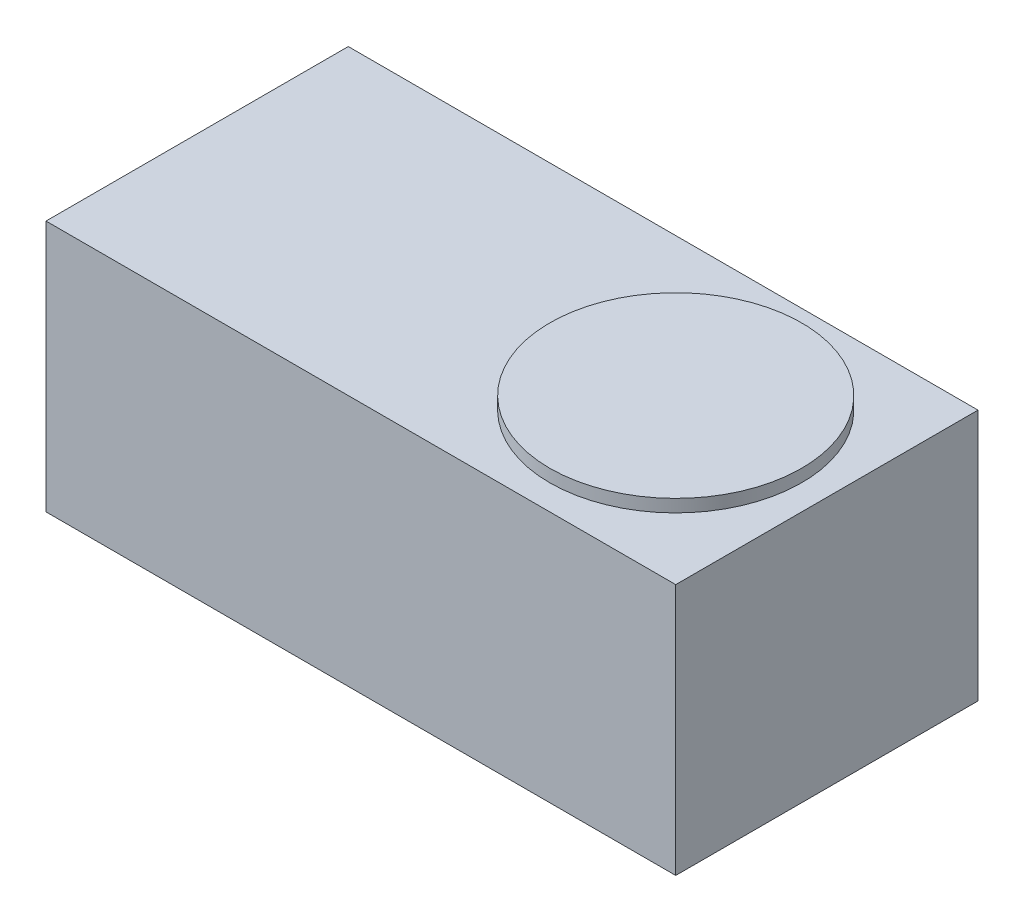
ISO-10303-21;
HEADER;
FILE_DESCRIPTION(('STEP AP214'),'2;1');
FILE_NAME('part.step','',(''),(''),'','','');
FILE_SCHEMA(('AUTOMOTIVE_DESIGN { 1 0 10303 214 1 1 1 1 }'));
ENDSEC;
DATA;
#1=APPLICATION_CONTEXT('core data for automotive mechanical design processes');
#2=APPLICATION_PROTOCOL_DEFINITION('international standard','automotive_design',2000,#1);
#3=PRODUCT_CONTEXT('',#1,'mechanical');
#4=PRODUCT('Part','Part','',(#3));
#5=PRODUCT_RELATED_PRODUCT_CATEGORY('part','',(#4));
#6=PRODUCT_DEFINITION_FORMATION('','',#4);
#7=PRODUCT_DEFINITION_CONTEXT('part definition',#1,'design');
#8=PRODUCT_DEFINITION('design','',#6,#7);
#9=PRODUCT_DEFINITION_SHAPE('','',#8);
#10=(LENGTH_UNIT() NAMED_UNIT(*) SI_UNIT(.MILLI.,.METRE.));
#11=(NAMED_UNIT(*) PLANE_ANGLE_UNIT() SI_UNIT($,.RADIAN.));
#12=(NAMED_UNIT(*) SI_UNIT($,.STERADIAN.) SOLID_ANGLE_UNIT());
#13=UNCERTAINTY_MEASURE_WITH_UNIT(LENGTH_MEASURE(1.E-05),#10,'distance_accuracy_value','');
#14=(GEOMETRIC_REPRESENTATION_CONTEXT(3) GLOBAL_UNCERTAINTY_ASSIGNED_CONTEXT((#13)) GLOBAL_UNIT_ASSIGNED_CONTEXT((#10,
#11,#12)) REPRESENTATION_CONTEXT('',''));
#15=CARTESIAN_POINT('',(0.,0.,0.));
#16=DIRECTION('',(0.,0.,1.));
#17=DIRECTION('',(1.,0.,0.));
#18=AXIS2_PLACEMENT_3D('',#15,#16,#17);
#19=CARTESIAN_POINT('',(0.,-29.2842712474619,0.));
#20=DIRECTION('',(0.,1.,0.));
#21=DIRECTION('',(0.,0.,1.));
#22=AXIS2_PLACEMENT_3D('',#19,#20,#21);
#23=CYLINDRICAL_SURFACE('',#22,10.);
#24=CARTESIAN_POINT('',(0.,-1.,0.));
#25=DIRECTION('',(0.,1.,0.));
#26=DIRECTION('',(0.,0.,1.));
#27=AXIS2_PLACEMENT_3D('',#24,#25,#26);
#28=CIRCLE('',#27,10.);
#29=CARTESIAN_POINT('',(0.,-1.,10.));
#30=VERTEX_POINT('',#29);
#31=EDGE_CURVE('E11',#30,#30,#28,.F.);
#32=ORIENTED_EDGE('',*,*,#31,.F.);
#33=EDGE_LOOP('',(#32));
#34=FACE_BOUND('',#33,.T.);
#35=CARTESIAN_POINT('',(0.,0.,0.));
#36=DIRECTION('',(0.,1.,0.));
#37=DIRECTION('',(0.,0.,1.));
#38=AXIS2_PLACEMENT_3D('',#35,#36,#37);
#39=CIRCLE('',#38,10.);
#40=CARTESIAN_POINT('',(0.,0.,10.));
#41=VERTEX_POINT('',#40);
#42=EDGE_CURVE('E42',#41,#41,#39,.T.);
#43=ORIENTED_EDGE('',*,*,#42,.F.);
#44=EDGE_LOOP('',(#43));
#45=FACE_BOUND('',#44,.T.);
#46=ADVANCED_FACE('F34',(#34,#45),#23,.T.);
#47=CARTESIAN_POINT('',(0.,0.,0.));
#48=DIRECTION('',(0.,1.,0.));
#49=DIRECTION('',(0.,0.,1.));
#50=AXIS2_PLACEMENT_3D('',#47,#48,#49);
#51=PLANE('',#50);
#52=ORIENTED_EDGE('',*,*,#42,.T.);
#53=EDGE_LOOP('',(#52));
#54=FACE_BOUND('',#53,.T.);
#55=ADVANCED_FACE('F114',(#54),#51,.T.);
#56=CARTESIAN_POINT('',(12.,-21.,-12.));
#57=DIRECTION('',(1.,0.,0.));
#58=DIRECTION('',(0.,0.,-1.));
#59=AXIS2_PLACEMENT_3D('',#56,#57,#58);
#60=PLANE('',#59);
#61=DIRECTION('',(0.,0.,-1.));
#62=VECTOR('',#61,1.);
#63=CARTESIAN_POINT('',(12.,-1.,-12.));
#64=LINE('',#63,#62);
#65=CARTESIAN_POINT('',(12.,-1.,12.));
#66=VERTEX_POINT('',#65);
#67=CARTESIAN_POINT('',(12.,-1.,-12.));
#68=VERTEX_POINT('',#67);
#69=EDGE_CURVE('E101',#66,#68,#64,.T.);
#70=ORIENTED_EDGE('',*,*,#69,.F.);
#71=DIRECTION('',(0.,1.,0.));
#72=VECTOR('',#71,1.);
#73=CARTESIAN_POINT('',(12.,-21.,12.));
#74=LINE('',#73,#72);
#75=CARTESIAN_POINT('',(12.,-21.,12.));
#76=VERTEX_POINT('',#75);
#77=EDGE_CURVE('E50',#76,#66,#74,.T.);
#78=ORIENTED_EDGE('',*,*,#77,.F.);
#79=DIRECTION('',(0.,0.,-1.));
#80=VECTOR('',#79,1.);
#81=CARTESIAN_POINT('',(12.,-21.,-12.));
#82=LINE('',#81,#80);
#83=CARTESIAN_POINT('',(12.,-21.,-12.));
#84=VERTEX_POINT('',#83);
#85=EDGE_CURVE('E95',#76,#84,#82,.T.);
#86=ORIENTED_EDGE('',*,*,#85,.T.);
#87=DIRECTION('',(0.,1.,0.));
#88=VECTOR('',#87,1.);
#89=CARTESIAN_POINT('',(12.,-21.,-12.));
#90=LINE('',#89,#88);
#91=EDGE_CURVE('E78',#84,#68,#90,.T.);
#92=ORIENTED_EDGE('',*,*,#91,.T.);
#93=EDGE_LOOP('',(#70,#78,#86,#92));
#94=FACE_BOUND('',#93,.T.);
#95=ADVANCED_FACE('F121',(#94),#60,.T.);
#96=CARTESIAN_POINT('',(12.,-21.,12.));
#97=DIRECTION('',(0.,0.,1.));
#98=DIRECTION('',(1.,0.,0.));
#99=AXIS2_PLACEMENT_3D('',#96,#97,#98);
#100=PLANE('',#99);
#101=DIRECTION('',(1.,0.,0.));
#102=VECTOR('',#101,1.);
#103=CARTESIAN_POINT('',(12.,-1.,12.));
#104=LINE('',#103,#102);
#105=CARTESIAN_POINT('',(-38.,-1.,12.));
#106=VERTEX_POINT('',#105);
#107=EDGE_CURVE('E97',#106,#66,#104,.T.);
#108=ORIENTED_EDGE('',*,*,#107,.F.);
#109=DIRECTION('',(0.,1.,0.));
#110=VECTOR('',#109,1.);
#111=CARTESIAN_POINT('',(-38.,-21.,12.));
#112=LINE('',#111,#110);
#113=CARTESIAN_POINT('',(-38.,-21.,12.));
#114=VERTEX_POINT('',#113);
#115=EDGE_CURVE('E67',#114,#106,#112,.T.);
#116=ORIENTED_EDGE('',*,*,#115,.F.);
#117=DIRECTION('',(1.,0.,0.));
#118=VECTOR('',#117,1.);
#119=CARTESIAN_POINT('',(12.,-21.,12.));
#120=LINE('',#119,#118);
#121=EDGE_CURVE('E92',#114,#76,#120,.T.);
#122=ORIENTED_EDGE('',*,*,#121,.T.);
#123=ORIENTED_EDGE('',*,*,#77,.T.);
#124=EDGE_LOOP('',(#108,#116,#122,#123));
#125=FACE_BOUND('',#124,.T.);
#126=ADVANCED_FACE('F128',(#125),#100,.T.);
#127=CARTESIAN_POINT('',(-38.,-21.,-12.));
#128=DIRECTION('',(-1.,0.,0.));
#129=DIRECTION('',(0.,0.,1.));
#130=AXIS2_PLACEMENT_3D('',#127,#128,#129);
#131=PLANE('',#130);
#132=DIRECTION('',(0.,0.,1.));
#133=VECTOR('',#132,1.);
#134=CARTESIAN_POINT('',(-38.,-1.,-12.));
#135=LINE('',#134,#133);
#136=CARTESIAN_POINT('',(-38.,-1.,-12.));
#137=VERTEX_POINT('',#136);
#138=EDGE_CURVE('E86',#137,#106,#135,.T.);
#139=ORIENTED_EDGE('',*,*,#138,.F.);
#140=DIRECTION('',(0.,1.,0.));
#141=VECTOR('',#140,1.);
#142=CARTESIAN_POINT('',(-38.,-21.,-12.));
#143=LINE('',#142,#141);
#144=CARTESIAN_POINT('',(-38.,-21.,-12.));
#145=VERTEX_POINT('',#144);
#146=EDGE_CURVE('E81',#145,#137,#143,.T.);
#147=ORIENTED_EDGE('',*,*,#146,.F.);
#148=DIRECTION('',(0.,0.,1.));
#149=VECTOR('',#148,1.);
#150=CARTESIAN_POINT('',(-38.,-21.,-12.));
#151=LINE('',#150,#149);
#152=EDGE_CURVE('E84',#145,#114,#151,.T.);
#153=ORIENTED_EDGE('',*,*,#152,.T.);
#154=ORIENTED_EDGE('',*,*,#115,.T.);
#155=EDGE_LOOP('',(#139,#147,#153,#154));
#156=FACE_BOUND('',#155,.T.);
#157=ADVANCED_FACE('F83',(#156),#131,.T.);
#158=CARTESIAN_POINT('',(12.,-21.,-12.));
#159=DIRECTION('',(0.,0.,-1.));
#160=DIRECTION('',(-1.,0.,0.));
#161=AXIS2_PLACEMENT_3D('',#158,#159,#160);
#162=PLANE('',#161);
#163=DIRECTION('',(-1.,0.,0.));
#164=VECTOR('',#163,1.);
#165=CARTESIAN_POINT('',(12.,-1.,-12.));
#166=LINE('',#165,#164);
#167=EDGE_CURVE('E104',#68,#137,#166,.T.);
#168=ORIENTED_EDGE('',*,*,#167,.F.);
#169=ORIENTED_EDGE('',*,*,#91,.F.);
#170=DIRECTION('',(-1.,0.,0.));
#171=VECTOR('',#170,1.);
#172=CARTESIAN_POINT('',(12.,-21.,-12.));
#173=LINE('',#172,#171);
#174=EDGE_CURVE('E91',#84,#145,#173,.T.);
#175=ORIENTED_EDGE('',*,*,#174,.T.);
#176=ORIENTED_EDGE('',*,*,#146,.T.);
#177=EDGE_LOOP('',(#168,#169,#175,#176));
#178=FACE_BOUND('',#177,.T.);
#179=ADVANCED_FACE('F94',(#178),#162,.T.);
#180=CARTESIAN_POINT('',(0.,-21.,0.));
#181=DIRECTION('',(0.,-1.,0.));
#182=DIRECTION('',(0.,0.,-1.));
#183=AXIS2_PLACEMENT_3D('',#180,#181,#182);
#184=PLANE('',#183);
#185=ORIENTED_EDGE('',*,*,#85,.F.);
#186=ORIENTED_EDGE('',*,*,#121,.F.);
#187=ORIENTED_EDGE('',*,*,#152,.F.);
#188=ORIENTED_EDGE('',*,*,#174,.F.);
#189=EDGE_LOOP('',(#185,#186,#187,#188));
#190=FACE_BOUND('',#189,.T.);
#191=ADVANCED_FACE('F90',(#190),#184,.T.);
#192=CARTESIAN_POINT('',(0.,-1.,0.));
#193=DIRECTION('',(0.,-1.,0.));
#194=DIRECTION('',(0.,0.,-1.));
#195=AXIS2_PLACEMENT_3D('',#192,#193,#194);
#196=PLANE('',#195);
#197=ORIENTED_EDGE('',*,*,#31,.T.);
#198=EDGE_LOOP('',(#197));
#199=FACE_BOUND('',#198,.T.);
#200=ORIENTED_EDGE('',*,*,#69,.T.);
#201=ORIENTED_EDGE('',*,*,#167,.T.);
#202=ORIENTED_EDGE('',*,*,#138,.T.);
#203=ORIENTED_EDGE('',*,*,#107,.T.);
#204=EDGE_LOOP('',(#200,#201,#202,#203));
#205=FACE_BOUND('',#204,.T.);
#206=ADVANCED_FACE('F124',(#199,#205),#196,.F.);
#207=CLOSED_SHELL('',(#46,#55,#95,#126,#157,#179,#191,#206));
#208=MANIFOLD_SOLID_BREP('B2',#207);
#209=ADVANCED_BREP_SHAPE_REPRESENTATION('',(#18,#208),#14);
#210=SHAPE_DEFINITION_REPRESENTATION(#9,#209);
ENDSEC;
END-ISO-10303-21;
